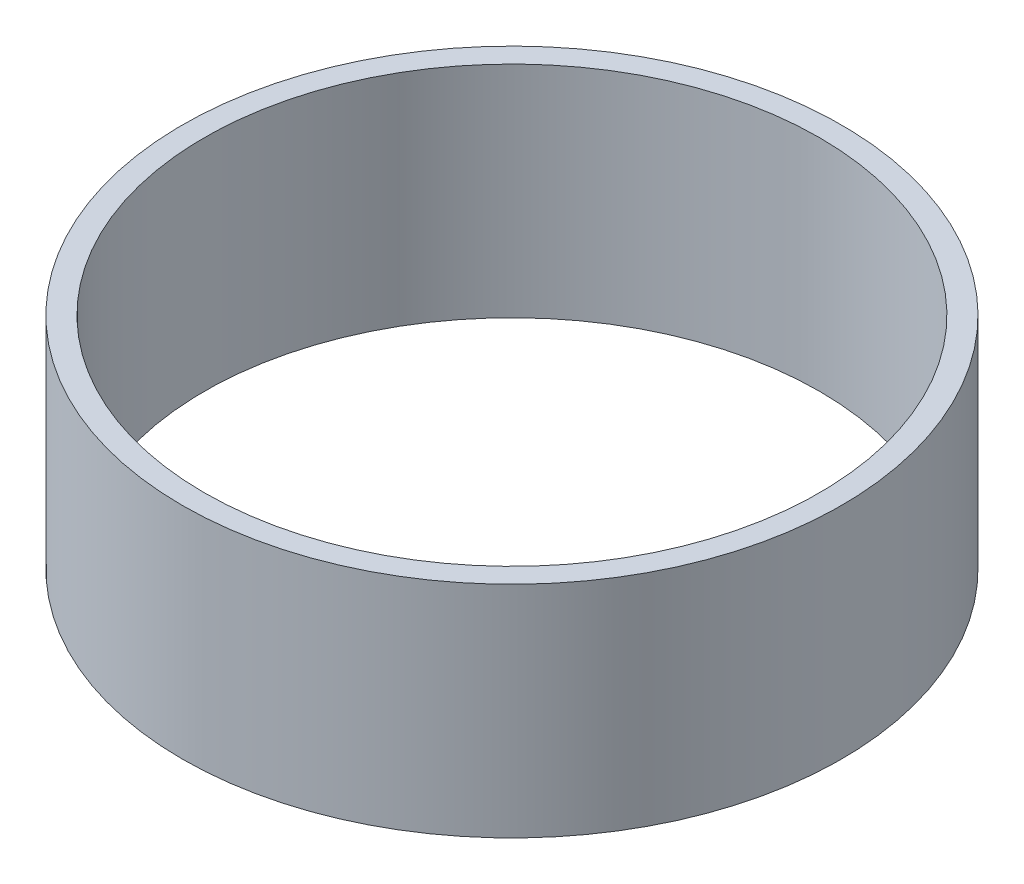
ISO-10303-21;
HEADER;
FILE_DESCRIPTION(('STEP AP214'),'2;1');
FILE_NAME('part.step','',(''),(''),'','','');
FILE_SCHEMA(('AUTOMOTIVE_DESIGN { 1 0 10303 214 1 1 1 1 }'));
ENDSEC;
DATA;
#1=APPLICATION_CONTEXT('core data for automotive mechanical design processes');
#2=APPLICATION_PROTOCOL_DEFINITION('international standard','automotive_design',2000,#1);
#3=PRODUCT_CONTEXT('',#1,'mechanical');
#4=PRODUCT('Part','Part','',(#3));
#5=PRODUCT_RELATED_PRODUCT_CATEGORY('part','',(#4));
#6=PRODUCT_DEFINITION_FORMATION('','',#4);
#7=PRODUCT_DEFINITION_CONTEXT('part definition',#1,'design');
#8=PRODUCT_DEFINITION('design','',#6,#7);
#9=PRODUCT_DEFINITION_SHAPE('','',#8);
#10=(LENGTH_UNIT() NAMED_UNIT(*) SI_UNIT(.MILLI.,.METRE.));
#11=(NAMED_UNIT(*) PLANE_ANGLE_UNIT() SI_UNIT($,.RADIAN.));
#12=(NAMED_UNIT(*) SI_UNIT($,.STERADIAN.) SOLID_ANGLE_UNIT());
#13=UNCERTAINTY_MEASURE_WITH_UNIT(LENGTH_MEASURE(1.E-05),#10,'distance_accuracy_value','');
#14=(GEOMETRIC_REPRESENTATION_CONTEXT(3) GLOBAL_UNCERTAINTY_ASSIGNED_CONTEXT((#13)) GLOBAL_UNIT_ASSIGNED_CONTEXT((#10,
#11,#12)) REPRESENTATION_CONTEXT('',''));
#15=CARTESIAN_POINT('',(0.,0.,0.));
#16=DIRECTION('',(0.,0.,1.));
#17=DIRECTION('',(1.,0.,0.));
#18=AXIS2_PLACEMENT_3D('',#15,#16,#17);
#19=CARTESIAN_POINT('',(0.,25.,0.));
#20=DIRECTION('',(0.,1.,0.));
#21=DIRECTION('',(0.,0.,1.));
#22=AXIS2_PLACEMENT_3D('',#19,#20,#21);
#23=PLANE('',#22);
#24=CARTESIAN_POINT('',(0.,25.,0.));
#25=DIRECTION('',(0.,1.,0.));
#26=DIRECTION('',(0.,0.,1.));
#27=AXIS2_PLACEMENT_3D('',#24,#25,#26);
#28=CIRCLE('',#27,37.5);
#29=CARTESIAN_POINT('',(0.,25.,37.5));
#30=VERTEX_POINT('',#29);
#31=EDGE_CURVE('E10',#30,#30,#28,.T.);
#32=ORIENTED_EDGE('',*,*,#31,.T.);
#33=EDGE_LOOP('',(#32));
#34=FACE_BOUND('',#33,.T.);
#35=CARTESIAN_POINT('',(0.,25.,0.));
#36=DIRECTION('',(0.,1.,0.));
#37=DIRECTION('',(0.,0.,1.));
#38=AXIS2_PLACEMENT_3D('',#35,#36,#37);
#39=CIRCLE('',#38,35.);
#40=CARTESIAN_POINT('',(0.,25.,35.));
#41=VERTEX_POINT('',#40);
#42=EDGE_CURVE('E43',#41,#41,#39,.T.);
#43=ORIENTED_EDGE('',*,*,#42,.F.);
#44=EDGE_LOOP('',(#43));
#45=FACE_BOUND('',#44,.T.);
#46=ADVANCED_FACE('F32',(#34,#45),#23,.T.);
#47=CARTESIAN_POINT('',(0.,0.,0.));
#48=DIRECTION('',(0.,1.,0.));
#49=DIRECTION('',(0.,0.,1.));
#50=AXIS2_PLACEMENT_3D('',#47,#48,#49);
#51=PLANE('',#50);
#52=CARTESIAN_POINT('',(0.,0.,0.));
#53=DIRECTION('',(0.,1.,0.));
#54=DIRECTION('',(0.,0.,1.));
#55=AXIS2_PLACEMENT_3D('',#52,#53,#54);
#56=CIRCLE('',#55,37.5);
#57=CARTESIAN_POINT('',(0.,0.,37.5));
#58=VERTEX_POINT('',#57);
#59=EDGE_CURVE('E36',#58,#58,#56,.T.);
#60=ORIENTED_EDGE('',*,*,#59,.F.);
#61=EDGE_LOOP('',(#60));
#62=FACE_BOUND('',#61,.T.);
#63=CARTESIAN_POINT('',(0.,0.,0.));
#64=DIRECTION('',(0.,1.,0.));
#65=DIRECTION('',(0.,0.,1.));
#66=AXIS2_PLACEMENT_3D('',#63,#64,#65);
#67=CIRCLE('',#66,35.);
#68=CARTESIAN_POINT('',(0.,0.,35.));
#69=VERTEX_POINT('',#68);
#70=EDGE_CURVE('E45',#69,#69,#67,.T.);
#71=ORIENTED_EDGE('',*,*,#70,.T.);
#72=EDGE_LOOP('',(#71));
#73=FACE_BOUND('',#72,.T.);
#74=ADVANCED_FACE('F55',(#62,#73),#51,.F.);
#75=CARTESIAN_POINT('',(0.,25.,0.));
#76=DIRECTION('',(0.,-1.,0.));
#77=DIRECTION('',(0.,0.,-1.));
#78=AXIS2_PLACEMENT_3D('',#75,#76,#77);
#79=CYLINDRICAL_SURFACE('',#78,37.5);
#80=ORIENTED_EDGE('',*,*,#31,.F.);
#81=EDGE_LOOP('',(#80));
#82=FACE_BOUND('',#81,.T.);
#83=ORIENTED_EDGE('',*,*,#59,.T.);
#84=EDGE_LOOP('',(#83));
#85=FACE_BOUND('',#84,.T.);
#86=ADVANCED_FACE('F34',(#82,#85),#79,.T.);
#87=CARTESIAN_POINT('',(0.,25.,0.));
#88=DIRECTION('',(0.,-1.,0.));
#89=DIRECTION('',(0.,0.,-1.));
#90=AXIS2_PLACEMENT_3D('',#87,#88,#89);
#91=CYLINDRICAL_SURFACE('',#90,35.);
#92=ORIENTED_EDGE('',*,*,#42,.T.);
#93=EDGE_LOOP('',(#92));
#94=FACE_BOUND('',#93,.T.);
#95=ORIENTED_EDGE('',*,*,#70,.F.);
#96=EDGE_LOOP('',(#95));
#97=FACE_BOUND('',#96,.T.);
#98=ADVANCED_FACE('F51',(#94,#97),#91,.F.);
#99=CLOSED_SHELL('',(#46,#74,#86,#98));
#100=MANIFOLD_SOLID_BREP('B2',#99);
#101=ADVANCED_BREP_SHAPE_REPRESENTATION('',(#18,#100),#14);
#102=SHAPE_DEFINITION_REPRESENTATION(#9,#101);
ENDSEC;
END-ISO-10303-21;
